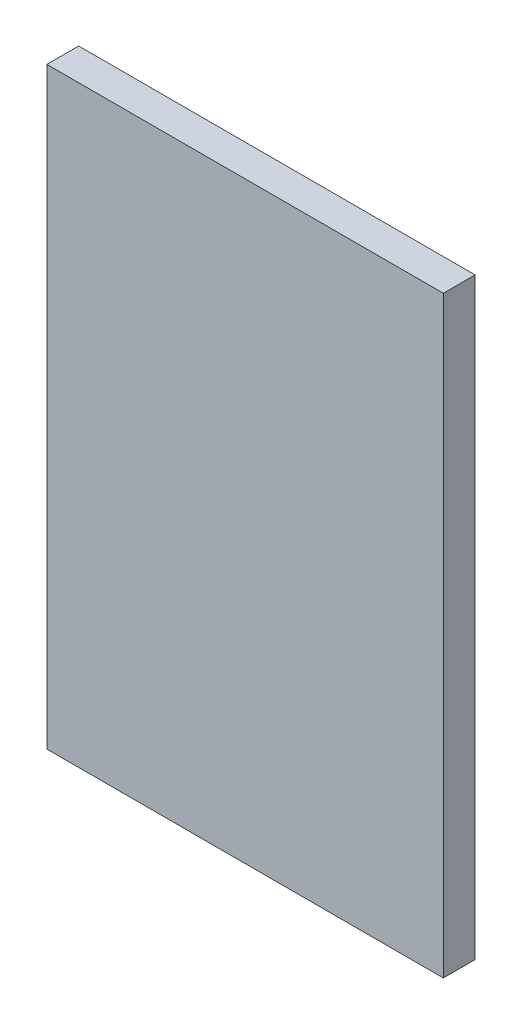
ISO-10303-21;
HEADER;
FILE_DESCRIPTION(('STEP AP214'),'2;1');
FILE_NAME('part.step','',(''),(''),'','','');
FILE_SCHEMA(('AUTOMOTIVE_DESIGN { 1 0 10303 214 1 1 1 1 }'));
ENDSEC;
DATA;
#1=APPLICATION_CONTEXT('core data for automotive mechanical design processes');
#2=APPLICATION_PROTOCOL_DEFINITION('international standard','automotive_design',2000,#1);
#3=PRODUCT_CONTEXT('',#1,'mechanical');
#4=PRODUCT('Part','Part','',(#3));
#5=PRODUCT_RELATED_PRODUCT_CATEGORY('part','',(#4));
#6=PRODUCT_DEFINITION_FORMATION('','',#4);
#7=PRODUCT_DEFINITION_CONTEXT('part definition',#1,'design');
#8=PRODUCT_DEFINITION('design','',#6,#7);
#9=PRODUCT_DEFINITION_SHAPE('','',#8);
#10=(LENGTH_UNIT() NAMED_UNIT(*) SI_UNIT(.MILLI.,.METRE.));
#11=(NAMED_UNIT(*) PLANE_ANGLE_UNIT() SI_UNIT($,.RADIAN.));
#12=(NAMED_UNIT(*) SI_UNIT($,.STERADIAN.) SOLID_ANGLE_UNIT());
#13=UNCERTAINTY_MEASURE_WITH_UNIT(LENGTH_MEASURE(1.E-05),#10,'distance_accuracy_value','');
#14=(GEOMETRIC_REPRESENTATION_CONTEXT(3) GLOBAL_UNCERTAINTY_ASSIGNED_CONTEXT((#13)) GLOBAL_UNIT_ASSIGNED_CONTEXT((#10,
#11,#12)) REPRESENTATION_CONTEXT('',''));
#15=CARTESIAN_POINT('',(0.,0.,0.));
#16=DIRECTION('',(0.,0.,1.));
#17=DIRECTION('',(1.,0.,0.));
#18=AXIS2_PLACEMENT_3D('',#15,#16,#17);
#19=CARTESIAN_POINT('',(87.2499999999999,130.5,14.));
#20=DIRECTION('',(-1.,0.,0.));
#21=DIRECTION('',(0.,0.,1.));
#22=AXIS2_PLACEMENT_3D('',#19,#20,#21);
#23=PLANE('',#22);
#24=DIRECTION('',(0.,1.,0.));
#25=VECTOR('',#24,1.);
#26=CARTESIAN_POINT('',(87.2499999999999,130.5,0.));
#27=LINE('',#26,#25);
#28=CARTESIAN_POINT('',(87.2499999999999,-130.5,0.));
#29=VERTEX_POINT('',#28);
#30=CARTESIAN_POINT('',(87.2499999999999,130.5,0.));
#31=VERTEX_POINT('',#30);
#32=EDGE_CURVE('E115',#29,#31,#27,.T.);
#33=ORIENTED_EDGE('',*,*,#32,.T.);
#34=DIRECTION('',(0.,0.,-1.));
#35=VECTOR('',#34,1.);
#36=CARTESIAN_POINT('',(87.2499999999999,130.5,14.));
#37=LINE('',#36,#35);
#38=CARTESIAN_POINT('',(87.2499999999999,130.5,14.));
#39=VERTEX_POINT('',#38);
#40=EDGE_CURVE('E11',#39,#31,#37,.T.);
#41=ORIENTED_EDGE('',*,*,#40,.F.);
#42=DIRECTION('',(0.,1.,0.));
#43=VECTOR('',#42,1.);
#44=CARTESIAN_POINT('',(87.2499999999999,130.5,14.));
#45=LINE('',#44,#43);
#46=CARTESIAN_POINT('',(87.2499999999999,-130.5,14.));
#47=VERTEX_POINT('',#46);
#48=EDGE_CURVE('E97',#47,#39,#45,.T.);
#49=ORIENTED_EDGE('',*,*,#48,.F.);
#50=DIRECTION('',(0.,0.,-1.));
#51=VECTOR('',#50,1.);
#52=CARTESIAN_POINT('',(87.2499999999999,-130.5,14.));
#53=LINE('',#52,#51);
#54=EDGE_CURVE('E111',#47,#29,#53,.T.);
#55=ORIENTED_EDGE('',*,*,#54,.T.);
#56=EDGE_LOOP('',(#33,#41,#49,#55));
#57=FACE_BOUND('',#56,.T.);
#58=ADVANCED_FACE('F45',(#57),#23,.F.);
#59=CARTESIAN_POINT('',(-87.2500000000001,130.5,14.));
#60=DIRECTION('',(0.,-1.,0.));
#61=DIRECTION('',(0.,0.,-1.));
#62=AXIS2_PLACEMENT_3D('',#59,#60,#61);
#63=PLANE('',#62);
#64=DIRECTION('',(-1.,0.,0.));
#65=VECTOR('',#64,1.);
#66=CARTESIAN_POINT('',(-87.2500000000001,130.5,0.));
#67=LINE('',#66,#65);
#68=CARTESIAN_POINT('',(-87.2500000000001,130.5,0.));
#69=VERTEX_POINT('',#68);
#70=EDGE_CURVE('E102',#31,#69,#67,.T.);
#71=ORIENTED_EDGE('',*,*,#70,.T.);
#72=DIRECTION('',(0.,0.,-1.));
#73=VECTOR('',#72,1.);
#74=CARTESIAN_POINT('',(-87.2500000000001,130.5,14.));
#75=LINE('',#74,#73);
#76=CARTESIAN_POINT('',(-87.2500000000001,130.5,14.));
#77=VERTEX_POINT('',#76);
#78=EDGE_CURVE('E54',#77,#69,#75,.T.);
#79=ORIENTED_EDGE('',*,*,#78,.F.);
#80=DIRECTION('',(-1.,0.,0.));
#81=VECTOR('',#80,1.);
#82=CARTESIAN_POINT('',(-87.2500000000001,130.5,14.));
#83=LINE('',#82,#81);
#84=EDGE_CURVE('E92',#39,#77,#83,.T.);
#85=ORIENTED_EDGE('',*,*,#84,.F.);
#86=ORIENTED_EDGE('',*,*,#40,.T.);
#87=EDGE_LOOP('',(#71,#79,#85,#86));
#88=FACE_BOUND('',#87,.T.);
#89=ADVANCED_FACE('F101',(#88),#63,.F.);
#90=CARTESIAN_POINT('',(-87.2500000000001,130.5,14.));
#91=DIRECTION('',(1.,0.,0.));
#92=DIRECTION('',(0.,0.,-1.));
#93=AXIS2_PLACEMENT_3D('',#90,#91,#92);
#94=PLANE('',#93);
#95=DIRECTION('',(0.,-1.,0.));
#96=VECTOR('',#95,1.);
#97=CARTESIAN_POINT('',(-87.2500000000001,130.5,0.));
#98=LINE('',#97,#96);
#99=CARTESIAN_POINT('',(-87.2500000000001,-130.5,0.));
#100=VERTEX_POINT('',#99);
#101=EDGE_CURVE('E79',#69,#100,#98,.T.);
#102=ORIENTED_EDGE('',*,*,#101,.T.);
#103=DIRECTION('',(0.,0.,-1.));
#104=VECTOR('',#103,1.);
#105=CARTESIAN_POINT('',(-87.2500000000001,-130.5,14.));
#106=LINE('',#105,#104);
#107=CARTESIAN_POINT('',(-87.2500000000001,-130.5,14.));
#108=VERTEX_POINT('',#107);
#109=EDGE_CURVE('E104',#108,#100,#106,.T.);
#110=ORIENTED_EDGE('',*,*,#109,.F.);
#111=DIRECTION('',(0.,-1.,0.));
#112=VECTOR('',#111,1.);
#113=CARTESIAN_POINT('',(-87.2500000000001,130.5,14.));
#114=LINE('',#113,#112);
#115=EDGE_CURVE('E95',#77,#108,#114,.T.);
#116=ORIENTED_EDGE('',*,*,#115,.F.);
#117=ORIENTED_EDGE('',*,*,#78,.T.);
#118=EDGE_LOOP('',(#102,#110,#116,#117));
#119=FACE_BOUND('',#118,.T.);
#120=ADVANCED_FACE('F105',(#119),#94,.F.);
#121=CARTESIAN_POINT('',(-87.2500000000001,-130.5,14.));
#122=DIRECTION('',(0.,1.,0.));
#123=DIRECTION('',(0.,0.,1.));
#124=AXIS2_PLACEMENT_3D('',#121,#122,#123);
#125=PLANE('',#124);
#126=DIRECTION('',(1.,0.,0.));
#127=VECTOR('',#126,1.);
#128=CARTESIAN_POINT('',(-87.2500000000001,-130.5,0.));
#129=LINE('',#128,#127);
#130=EDGE_CURVE('E85',#100,#29,#129,.T.);
#131=ORIENTED_EDGE('',*,*,#130,.T.);
#132=ORIENTED_EDGE('',*,*,#54,.F.);
#133=DIRECTION('',(1.,0.,0.));
#134=VECTOR('',#133,1.);
#135=CARTESIAN_POINT('',(-87.2500000000001,-130.5,14.));
#136=LINE('',#135,#134);
#137=EDGE_CURVE('E62',#108,#47,#136,.T.);
#138=ORIENTED_EDGE('',*,*,#137,.F.);
#139=ORIENTED_EDGE('',*,*,#109,.T.);
#140=EDGE_LOOP('',(#131,#132,#138,#139));
#141=FACE_BOUND('',#140,.T.);
#142=ADVANCED_FACE('F126',(#141),#125,.F.);
#143=CARTESIAN_POINT('',(0.,0.,14.));
#144=DIRECTION('',(0.,0.,1.));
#145=DIRECTION('',(1.,0.,0.));
#146=AXIS2_PLACEMENT_3D('',#143,#144,#145);
#147=PLANE('',#146);
#148=ORIENTED_EDGE('',*,*,#48,.T.);
#149=ORIENTED_EDGE('',*,*,#84,.T.);
#150=ORIENTED_EDGE('',*,*,#115,.T.);
#151=ORIENTED_EDGE('',*,*,#137,.T.);
#152=EDGE_LOOP('',(#148,#149,#150,#151));
#153=FACE_BOUND('',#152,.T.);
#154=ADVANCED_FACE('F93',(#153),#147,.T.);
#155=CARTESIAN_POINT('',(0.,0.,0.));
#156=DIRECTION('',(0.,0.,1.));
#157=DIRECTION('',(1.,0.,0.));
#158=AXIS2_PLACEMENT_3D('',#155,#156,#157);
#159=PLANE('',#158);
#160=ORIENTED_EDGE('',*,*,#32,.F.);
#161=ORIENTED_EDGE('',*,*,#130,.F.);
#162=ORIENTED_EDGE('',*,*,#101,.F.);
#163=ORIENTED_EDGE('',*,*,#70,.F.);
#164=EDGE_LOOP('',(#160,#161,#162,#163));
#165=FACE_BOUND('',#164,.T.);
#166=ADVANCED_FACE('F129',(#165),#159,.F.);
#167=CLOSED_SHELL('',(#58,#89,#120,#142,#154,#166));
#168=MANIFOLD_SOLID_BREP('B2',#167);
#169=ADVANCED_BREP_SHAPE_REPRESENTATION('',(#18,#168),#14);
#170=SHAPE_DEFINITION_REPRESENTATION(#9,#169);
ENDSEC;
END-ISO-10303-21;
